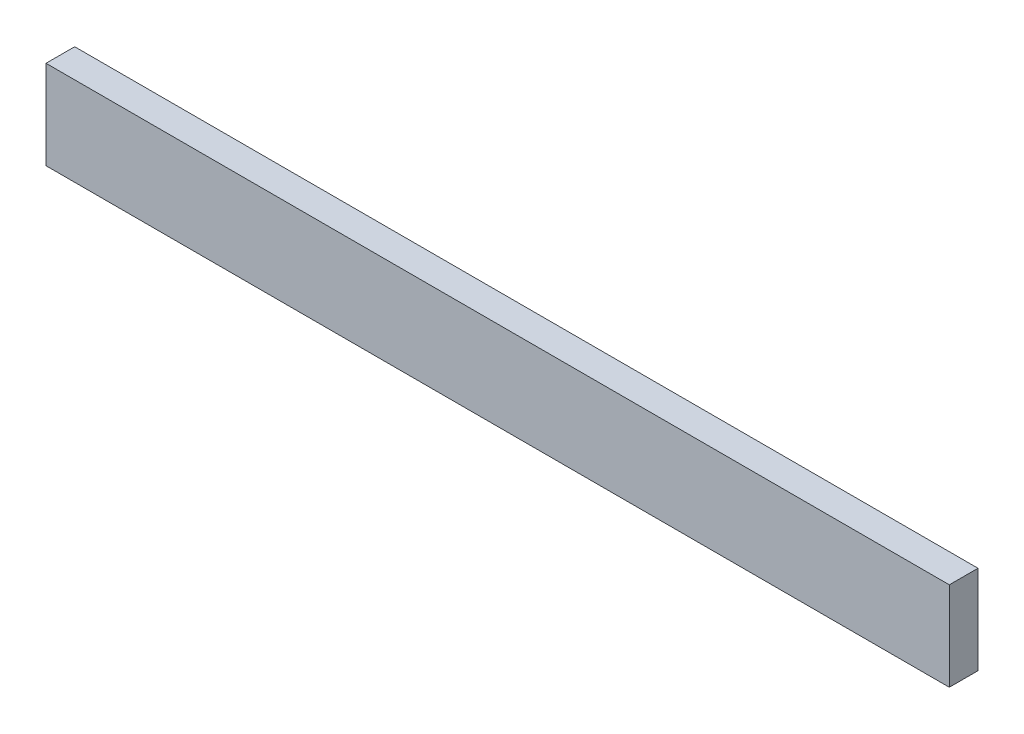
ISO-10303-21;
HEADER;
FILE_DESCRIPTION(('STEP AP214'),'2;1');
FILE_NAME('part.step','',(''),(''),'','','');
FILE_SCHEMA(('AUTOMOTIVE_DESIGN { 1 0 10303 214 1 1 1 1 }'));
ENDSEC;
DATA;
#1=APPLICATION_CONTEXT('core data for automotive mechanical design processes');
#2=APPLICATION_PROTOCOL_DEFINITION('international standard','automotive_design',2000,#1);
#3=PRODUCT_CONTEXT('',#1,'mechanical');
#4=PRODUCT('Part','Part','',(#3));
#5=PRODUCT_RELATED_PRODUCT_CATEGORY('part','',(#4));
#6=PRODUCT_DEFINITION_FORMATION('','',#4);
#7=PRODUCT_DEFINITION_CONTEXT('part definition',#1,'design');
#8=PRODUCT_DEFINITION('design','',#6,#7);
#9=PRODUCT_DEFINITION_SHAPE('','',#8);
#10=(LENGTH_UNIT() NAMED_UNIT(*) SI_UNIT(.MILLI.,.METRE.));
#11=(NAMED_UNIT(*) PLANE_ANGLE_UNIT() SI_UNIT($,.RADIAN.));
#12=(NAMED_UNIT(*) SI_UNIT($,.STERADIAN.) SOLID_ANGLE_UNIT());
#13=UNCERTAINTY_MEASURE_WITH_UNIT(LENGTH_MEASURE(1.E-05),#10,'distance_accuracy_value','');
#14=(GEOMETRIC_REPRESENTATION_CONTEXT(3) GLOBAL_UNCERTAINTY_ASSIGNED_CONTEXT((#13)) GLOBAL_UNIT_ASSIGNED_CONTEXT((#10,
#11,#12)) REPRESENTATION_CONTEXT('',''));
#15=CARTESIAN_POINT('',(0.,0.,0.));
#16=DIRECTION('',(0.,0.,1.));
#17=DIRECTION('',(1.,0.,0.));
#18=AXIS2_PLACEMENT_3D('',#15,#16,#17);
#19=CARTESIAN_POINT('',(-361.951634361008,-19.05,0.));
#20=DIRECTION('',(0.,0.,1.));
#21=DIRECTION('',(1.,0.,0.));
#22=AXIS2_PLACEMENT_3D('',#19,#20,#21);
#23=PLANE('',#22);
#24=DIRECTION('',(0.,1.,0.));
#25=VECTOR('',#24,1.);
#26=CARTESIAN_POINT('',(-300.,-19.05,0.));
#27=LINE('',#26,#25);
#28=CARTESIAN_POINT('',(-300.,-78.,0.));
#29=VERTEX_POINT('',#28);
#30=CARTESIAN_POINT('',(-300.,-19.05,0.));
#31=VERTEX_POINT('',#30);
#32=EDGE_CURVE('E41',#29,#31,#27,.T.);
#33=ORIENTED_EDGE('',*,*,#32,.F.);
#34=DIRECTION('',(1.,0.,0.));
#35=VECTOR('',#34,1.);
#36=CARTESIAN_POINT('',(-361.951634361008,-78.,0.));
#37=LINE('',#36,#35);
#38=CARTESIAN_POINT('',(300.,-78.,0.));
#39=VERTEX_POINT('',#38);
#40=EDGE_CURVE('E69',#29,#39,#37,.T.);
#41=ORIENTED_EDGE('',*,*,#40,.T.);
#42=DIRECTION('',(0.,-1.,0.));
#43=VECTOR('',#42,1.);
#44=CARTESIAN_POINT('',(300.,-19.05,0.));
#45=LINE('',#44,#43);
#46=CARTESIAN_POINT('',(300.,-19.05,0.));
#47=VERTEX_POINT('',#46);
#48=EDGE_CURVE('E73',#47,#39,#45,.T.);
#49=ORIENTED_EDGE('',*,*,#48,.F.);
#50=DIRECTION('',(1.,0.,0.));
#51=VECTOR('',#50,1.);
#52=CARTESIAN_POINT('',(-361.951634361008,-19.05,0.));
#53=LINE('',#52,#51);
#54=EDGE_CURVE('E96',#31,#47,#53,.T.);
#55=ORIENTED_EDGE('',*,*,#54,.F.);
#56=EDGE_LOOP('',(#33,#41,#49,#55));
#57=FACE_BOUND('',#56,.T.);
#58=ADVANCED_FACE('F33',(#57),#23,.T.);
#59=CARTESIAN_POINT('',(-361.951634361008,-19.05,0.));
#60=DIRECTION('',(0.,1.,0.));
#61=DIRECTION('',(0.,0.,1.));
#62=AXIS2_PLACEMENT_3D('',#59,#60,#61);
#63=PLANE('',#62);
#64=DIRECTION('',(0.,0.,-1.));
#65=VECTOR('',#64,1.);
#66=CARTESIAN_POINT('',(-300.,-19.05,0.));
#67=LINE('',#66,#65);
#68=CARTESIAN_POINT('',(-300.,-19.05,-19.05));
#69=VERTEX_POINT('',#68);
#70=EDGE_CURVE('E47',#31,#69,#67,.T.);
#71=ORIENTED_EDGE('',*,*,#70,.F.);
#72=ORIENTED_EDGE('',*,*,#54,.T.);
#73=DIRECTION('',(0.,0.,1.));
#74=VECTOR('',#73,1.);
#75=CARTESIAN_POINT('',(300.,-19.05,0.));
#76=LINE('',#75,#74);
#77=CARTESIAN_POINT('',(300.,-19.05,-19.05));
#78=VERTEX_POINT('',#77);
#79=EDGE_CURVE('E78',#78,#47,#76,.T.);
#80=ORIENTED_EDGE('',*,*,#79,.F.);
#81=DIRECTION('',(1.,0.,0.));
#82=VECTOR('',#81,1.);
#83=CARTESIAN_POINT('',(-361.951634361008,-19.05,-19.05));
#84=LINE('',#83,#82);
#85=EDGE_CURVE('E99',#69,#78,#84,.T.);
#86=ORIENTED_EDGE('',*,*,#85,.F.);
#87=EDGE_LOOP('',(#71,#72,#80,#86));
#88=FACE_BOUND('',#87,.T.);
#89=ADVANCED_FACE('F105',(#88),#63,.T.);
#90=CARTESIAN_POINT('',(-361.951634361008,-19.05,-19.05));
#91=DIRECTION('',(0.,0.,-1.));
#92=DIRECTION('',(-1.,0.,0.));
#93=AXIS2_PLACEMENT_3D('',#90,#91,#92);
#94=PLANE('',#93);
#95=DIRECTION('',(0.,-1.,0.));
#96=VECTOR('',#95,1.);
#97=CARTESIAN_POINT('',(-300.,-19.05,-19.05));
#98=LINE('',#97,#96);
#99=CARTESIAN_POINT('',(-300.,-78.,-19.05));
#100=VERTEX_POINT('',#99);
#101=EDGE_CURVE('E98',#69,#100,#98,.T.);
#102=ORIENTED_EDGE('',*,*,#101,.F.);
#103=ORIENTED_EDGE('',*,*,#85,.T.);
#104=DIRECTION('',(0.,1.,0.));
#105=VECTOR('',#104,1.);
#106=CARTESIAN_POINT('',(300.,-19.05,-19.05));
#107=LINE('',#106,#105);
#108=CARTESIAN_POINT('',(300.,-78.,-19.05));
#109=VERTEX_POINT('',#108);
#110=EDGE_CURVE('E86',#109,#78,#107,.T.);
#111=ORIENTED_EDGE('',*,*,#110,.F.);
#112=DIRECTION('',(1.,0.,0.));
#113=VECTOR('',#112,1.);
#114=CARTESIAN_POINT('',(-361.951634361008,-78.,-19.05));
#115=LINE('',#114,#113);
#116=EDGE_CURVE('E77',#100,#109,#115,.T.);
#117=ORIENTED_EDGE('',*,*,#116,.F.);
#118=EDGE_LOOP('',(#102,#103,#111,#117));
#119=FACE_BOUND('',#118,.T.);
#120=ADVANCED_FACE('F103',(#119),#94,.T.);
#121=CARTESIAN_POINT('',(-361.951634361008,-78.,0.));
#122=DIRECTION('',(0.,-1.,0.));
#123=DIRECTION('',(0.,0.,-1.));
#124=AXIS2_PLACEMENT_3D('',#121,#122,#123);
#125=PLANE('',#124);
#126=DIRECTION('',(0.,0.,1.));
#127=VECTOR('',#126,1.);
#128=CARTESIAN_POINT('',(-300.,-78.,0.));
#129=LINE('',#128,#127);
#130=EDGE_CURVE('E11',#100,#29,#129,.T.);
#131=ORIENTED_EDGE('',*,*,#130,.F.);
#132=ORIENTED_EDGE('',*,*,#116,.T.);
#133=DIRECTION('',(0.,0.,-1.));
#134=VECTOR('',#133,1.);
#135=CARTESIAN_POINT('',(300.,-78.,0.));
#136=LINE('',#135,#134);
#137=EDGE_CURVE('E80',#39,#109,#136,.T.);
#138=ORIENTED_EDGE('',*,*,#137,.F.);
#139=ORIENTED_EDGE('',*,*,#40,.F.);
#140=EDGE_LOOP('',(#131,#132,#138,#139));
#141=FACE_BOUND('',#140,.T.);
#142=ADVANCED_FACE('F81',(#141),#125,.T.);
#143=CARTESIAN_POINT('',(300.,0.,0.));
#144=DIRECTION('',(1.,0.,0.));
#145=DIRECTION('',(0.,0.,-1.));
#146=AXIS2_PLACEMENT_3D('',#143,#144,#145);
#147=PLANE('',#146);
#148=ORIENTED_EDGE('',*,*,#48,.T.);
#149=ORIENTED_EDGE('',*,*,#137,.T.);
#150=ORIENTED_EDGE('',*,*,#110,.T.);
#151=ORIENTED_EDGE('',*,*,#79,.T.);
#152=EDGE_LOOP('',(#148,#149,#150,#151));
#153=FACE_BOUND('',#152,.T.);
#154=ADVANCED_FACE('F88',(#153),#147,.T.);
#155=CARTESIAN_POINT('',(-300.,-97.05,25.0000000000001));
#156=DIRECTION('',(1.,0.,0.));
#157=DIRECTION('',(0.,-1.,0.));
#158=AXIS2_PLACEMENT_3D('',#155,#156,#157);
#159=PLANE('',#158);
#160=ORIENTED_EDGE('',*,*,#32,.T.);
#161=ORIENTED_EDGE('',*,*,#70,.T.);
#162=ORIENTED_EDGE('',*,*,#101,.T.);
#163=ORIENTED_EDGE('',*,*,#130,.T.);
#164=EDGE_LOOP('',(#160,#161,#162,#163));
#165=FACE_BOUND('',#164,.T.);
#166=ADVANCED_FACE('F107',(#165),#159,.F.);
#167=CLOSED_SHELL('',(#58,#89,#120,#142,#154,#166));
#168=MANIFOLD_SOLID_BREP('B2',#167);
#169=ADVANCED_BREP_SHAPE_REPRESENTATION('',(#18,#168),#14);
#170=SHAPE_DEFINITION_REPRESENTATION(#9,#169);
ENDSEC;
END-ISO-10303-21;
